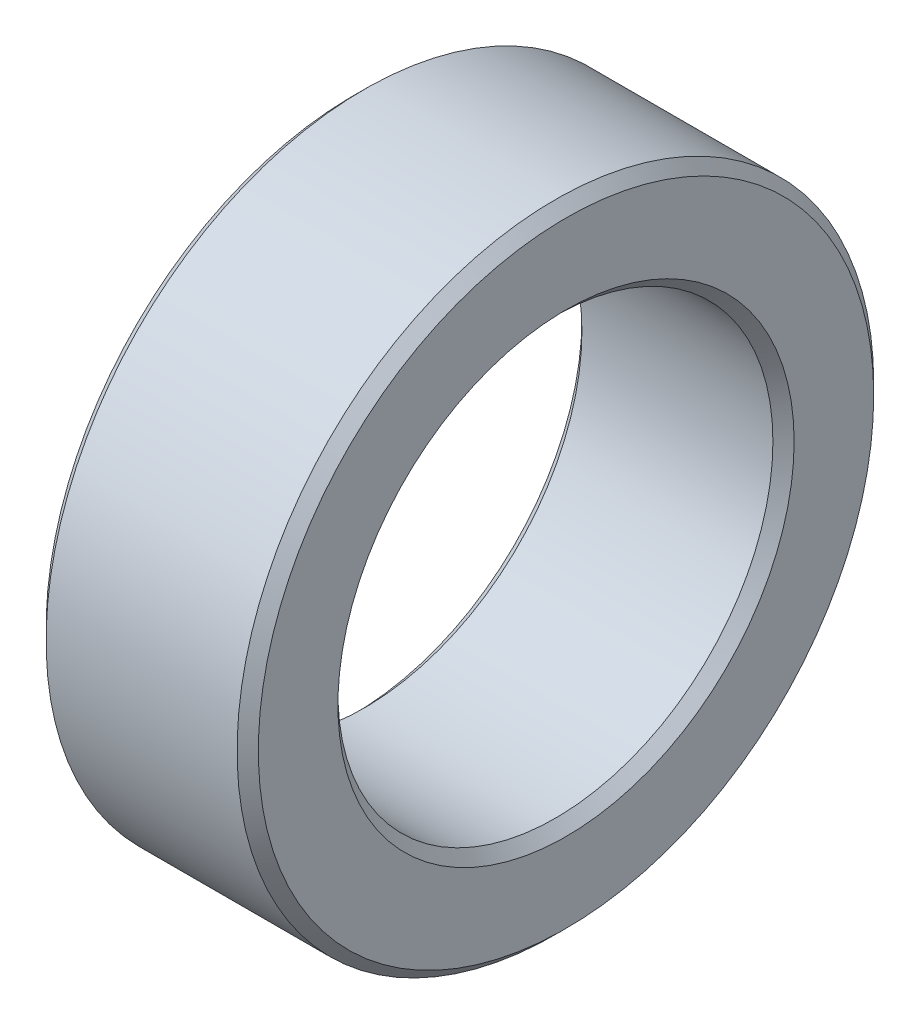
ISO-10303-21;
HEADER;
FILE_DESCRIPTION(('STEP AP214'),'2;1');
FILE_NAME('part.step','',(''),(''),'','','');
FILE_SCHEMA(('AUTOMOTIVE_DESIGN { 1 0 10303 214 1 1 1 1 }'));
ENDSEC;
DATA;
#1=APPLICATION_CONTEXT('core data for automotive mechanical design processes');
#2=APPLICATION_PROTOCOL_DEFINITION('international standard','automotive_design',2000,#1);
#3=PRODUCT_CONTEXT('',#1,'mechanical');
#4=PRODUCT('Part','Part','',(#3));
#5=PRODUCT_RELATED_PRODUCT_CATEGORY('part','',(#4));
#6=PRODUCT_DEFINITION_FORMATION('','',#4);
#7=PRODUCT_DEFINITION_CONTEXT('part definition',#1,'design');
#8=PRODUCT_DEFINITION('design','',#6,#7);
#9=PRODUCT_DEFINITION_SHAPE('','',#8);
#10=(LENGTH_UNIT() NAMED_UNIT(*) SI_UNIT(.MILLI.,.METRE.));
#11=(NAMED_UNIT(*) PLANE_ANGLE_UNIT() SI_UNIT($,.RADIAN.));
#12=(NAMED_UNIT(*) SI_UNIT($,.STERADIAN.) SOLID_ANGLE_UNIT());
#13=UNCERTAINTY_MEASURE_WITH_UNIT(LENGTH_MEASURE(1.E-05),#10,'distance_accuracy_value','');
#14=(GEOMETRIC_REPRESENTATION_CONTEXT(3) GLOBAL_UNCERTAINTY_ASSIGNED_CONTEXT((#13)) GLOBAL_UNIT_ASSIGNED_CONTEXT((#10,
#11,#12)) REPRESENTATION_CONTEXT('',''));
#15=CARTESIAN_POINT('',(0.,0.,0.));
#16=DIRECTION('',(0.,0.,1.));
#17=DIRECTION('',(1.,0.,0.));
#18=AXIS2_PLACEMENT_3D('',#15,#16,#17);
#19=CARTESIAN_POINT('',(2.,0.,0.));
#20=DIRECTION('',(1.,0.,0.));
#21=DIRECTION('',(0.,0.,-1.));
#22=AXIS2_PLACEMENT_3D('',#19,#20,#21);
#23=PLANE('',#22);
#24=CARTESIAN_POINT('',(2.,0.,0.));
#25=DIRECTION('',(1.,0.,0.));
#26=DIRECTION('',(0.,0.,-1.));
#27=AXIS2_PLACEMENT_3D('',#24,#25,#26);
#28=CIRCLE('',#27,2.15);
#29=CARTESIAN_POINT('',(2.,0.,-2.15));
#30=VERTEX_POINT('',#29);
#31=EDGE_CURVE('E60',#30,#30,#28,.F.);
#32=ORIENTED_EDGE('',*,*,#31,.T.);
#33=EDGE_LOOP('',(#32));
#34=FACE_BOUND('',#33,.T.);
#35=CARTESIAN_POINT('',(2.,0.,0.));
#36=DIRECTION('',(1.,0.,0.));
#37=DIRECTION('',(0.,0.,-1.));
#38=AXIS2_PLACEMENT_3D('',#35,#36,#37);
#39=CIRCLE('',#38,2.9);
#40=CARTESIAN_POINT('',(2.,0.,-2.9));
#41=VERTEX_POINT('',#40);
#42=EDGE_CURVE('E63',#41,#41,#39,.T.);
#43=ORIENTED_EDGE('',*,*,#42,.T.);
#44=EDGE_LOOP('',(#43));
#45=FACE_BOUND('',#44,.T.);
#46=ADVANCED_FACE('F39',(#34,#45),#23,.T.);
#47=CARTESIAN_POINT('',(0.,0.,0.));
#48=DIRECTION('',(1.,0.,0.));
#49=DIRECTION('',(0.,0.,-1.));
#50=AXIS2_PLACEMENT_3D('',#47,#48,#49);
#51=PLANE('',#50);
#52=CARTESIAN_POINT('',(0.,0.,0.));
#53=DIRECTION('',(1.,0.,0.));
#54=DIRECTION('',(0.,0.,-1.));
#55=AXIS2_PLACEMENT_3D('',#52,#53,#54);
#56=CIRCLE('',#55,2.15);
#57=CARTESIAN_POINT('',(0.,0.,-2.15));
#58=VERTEX_POINT('',#57);
#59=EDGE_CURVE('E51',#58,#58,#56,.T.);
#60=ORIENTED_EDGE('',*,*,#59,.T.);
#61=EDGE_LOOP('',(#60));
#62=FACE_BOUND('',#61,.T.);
#63=CARTESIAN_POINT('',(0.,0.,0.));
#64=DIRECTION('',(1.,0.,0.));
#65=DIRECTION('',(0.,0.,-1.));
#66=AXIS2_PLACEMENT_3D('',#63,#64,#65);
#67=CIRCLE('',#66,2.9);
#68=CARTESIAN_POINT('',(0.,0.,-2.9));
#69=VERTEX_POINT('',#68);
#70=EDGE_CURVE('E55',#69,#69,#67,.F.);
#71=ORIENTED_EDGE('',*,*,#70,.T.);
#72=EDGE_LOOP('',(#71));
#73=FACE_BOUND('',#72,.T.);
#74=ADVANCED_FACE('F83',(#62,#73),#51,.F.);
#75=CARTESIAN_POINT('',(2.,0.,0.));
#76=DIRECTION('',(-1.,0.,0.));
#77=DIRECTION('',(0.,0.,1.));
#78=AXIS2_PLACEMENT_3D('',#75,#76,#77);
#79=CYLINDRICAL_SURFACE('',#78,3.);
#80=CARTESIAN_POINT('',(0.0999999999999994,0.,0.));
#81=DIRECTION('',(1.,0.,0.));
#82=DIRECTION('',(0.,0.,-1.));
#83=AXIS2_PLACEMENT_3D('',#80,#81,#82);
#84=CIRCLE('',#83,3.);
#85=CARTESIAN_POINT('',(0.0999999999999994,0.,-3.));
#86=VERTEX_POINT('',#85);
#87=EDGE_CURVE('E10',#86,#86,#84,.T.);
#88=ORIENTED_EDGE('',*,*,#87,.T.);
#89=EDGE_LOOP('',(#88));
#90=FACE_BOUND('',#89,.T.);
#91=CARTESIAN_POINT('',(1.9,0.,0.));
#92=DIRECTION('',(1.,0.,0.));
#93=DIRECTION('',(0.,0.,-1.));
#94=AXIS2_PLACEMENT_3D('',#91,#92,#93);
#95=CIRCLE('',#94,3.);
#96=CARTESIAN_POINT('',(1.9,0.,-3.));
#97=VERTEX_POINT('',#96);
#98=EDGE_CURVE('E47',#97,#97,#95,.F.);
#99=ORIENTED_EDGE('',*,*,#98,.T.);
#100=EDGE_LOOP('',(#99));
#101=FACE_BOUND('',#100,.T.);
#102=ADVANCED_FACE('F86',(#90,#101),#79,.T.);
#103=CARTESIAN_POINT('',(2.,0.,0.));
#104=DIRECTION('',(-1.,0.,0.));
#105=DIRECTION('',(0.,0.,1.));
#106=AXIS2_PLACEMENT_3D('',#103,#104,#105);
#107=CYLINDRICAL_SURFACE('',#106,2.05);
#108=CARTESIAN_POINT('',(1.9,0.,0.));
#109=DIRECTION('',(1.,0.,0.));
#110=DIRECTION('',(0.,0.,-1.));
#111=AXIS2_PLACEMENT_3D('',#108,#109,#110);
#112=CIRCLE('',#111,2.05);
#113=CARTESIAN_POINT('',(1.9,0.,-2.05));
#114=VERTEX_POINT('',#113);
#115=EDGE_CURVE('E66',#114,#114,#112,.T.);
#116=ORIENTED_EDGE('',*,*,#115,.T.);
#117=EDGE_LOOP('',(#116));
#118=FACE_BOUND('',#117,.T.);
#119=CARTESIAN_POINT('',(0.100000000000001,0.,0.));
#120=DIRECTION('',(1.,0.,0.));
#121=DIRECTION('',(0.,0.,-1.));
#122=AXIS2_PLACEMENT_3D('',#119,#120,#121);
#123=CIRCLE('',#122,2.05);
#124=CARTESIAN_POINT('',(0.100000000000001,0.,-2.05));
#125=VERTEX_POINT('',#124);
#126=EDGE_CURVE('E69',#125,#125,#123,.F.);
#127=ORIENTED_EDGE('',*,*,#126,.T.);
#128=EDGE_LOOP('',(#127));
#129=FACE_BOUND('',#128,.T.);
#130=ADVANCED_FACE('F73',(#118,#129),#107,.F.);
#131=CARTESIAN_POINT('',(1.9,0.,0.));
#132=DIRECTION('',(1.,0.,0.));
#133=DIRECTION('',(0.,0.,-1.));
#134=AXIS2_PLACEMENT_3D('',#131,#132,#133);
#135=CONICAL_SURFACE('',#134,2.05,0.785398163397446);
#136=CARTESIAN_POINT('',(2.,0.,-2.15));
#137=CARTESIAN_POINT('',(1.99895833333333,0.,-2.14895833333333));
#138=CARTESIAN_POINT('',(1.99791666666667,0.,-2.14791666666667));
#139=CARTESIAN_POINT('',(1.99583333333333,0.,-2.14583333333333));
#140=CARTESIAN_POINT('',(1.99479166666667,0.,-2.14479166666667));
#141=CARTESIAN_POINT('',(1.99270833333333,0.,-2.14270833333333));
#142=CARTESIAN_POINT('',(1.99166666666667,0.,-2.14166666666667));
#143=CARTESIAN_POINT('',(1.98958333333333,0.,-2.13958333333333));
#144=CARTESIAN_POINT('',(1.98854166666667,0.,-2.13854166666667));
#145=CARTESIAN_POINT('',(1.98645833333333,0.,-2.13645833333333));
#146=CARTESIAN_POINT('',(1.98541666666667,0.,-2.13541666666667));
#147=CARTESIAN_POINT('',(1.98333333333333,0.,-2.13333333333333));
#148=CARTESIAN_POINT('',(1.98229166666667,0.,-2.13229166666667));
#149=CARTESIAN_POINT('',(1.98020833333333,0.,-2.13020833333333));
#150=CARTESIAN_POINT('',(1.97916666666667,0.,-2.12916666666667));
#151=CARTESIAN_POINT('',(1.97708333333333,0.,-2.12708333333333));
#152=CARTESIAN_POINT('',(1.97604166666667,0.,-2.12604166666667));
#153=CARTESIAN_POINT('',(1.97395833333333,0.,-2.12395833333333));
#154=CARTESIAN_POINT('',(1.97291666666667,0.,-2.12291666666667));
#155=CARTESIAN_POINT('',(1.97083333333333,0.,-2.12083333333333));
#156=CARTESIAN_POINT('',(1.96979166666667,0.,-2.11979166666667));
#157=CARTESIAN_POINT('',(1.96770833333333,0.,-2.11770833333333));
#158=CARTESIAN_POINT('',(1.96666666666667,0.,-2.11666666666667));
#159=CARTESIAN_POINT('',(1.96458333333333,0.,-2.11458333333333));
#160=CARTESIAN_POINT('',(1.96354166666667,0.,-2.11354166666667));
#161=CARTESIAN_POINT('',(1.96145833333333,0.,-2.11145833333333));
#162=CARTESIAN_POINT('',(1.96041666666667,0.,-2.11041666666667));
#163=CARTESIAN_POINT('',(1.95833333333333,0.,-2.10833333333333));
#164=CARTESIAN_POINT('',(1.95729166666667,0.,-2.10729166666667));
#165=CARTESIAN_POINT('',(1.95520833333333,0.,-2.10520833333333));
#166=CARTESIAN_POINT('',(1.95416666666667,0.,-2.10416666666667));
#167=CARTESIAN_POINT('',(1.95208333333333,0.,-2.10208333333333));
#168=CARTESIAN_POINT('',(1.95104166666667,0.,-2.10104166666667));
#169=CARTESIAN_POINT('',(1.94895833333333,0.,-2.09895833333333));
#170=CARTESIAN_POINT('',(1.94791666666667,0.,-2.09791666666667));
#171=CARTESIAN_POINT('',(1.94583333333333,0.,-2.09583333333333));
#172=CARTESIAN_POINT('',(1.94479166666667,0.,-2.09479166666667));
#173=CARTESIAN_POINT('',(1.94270833333333,0.,-2.09270833333333));
#174=CARTESIAN_POINT('',(1.94166666666667,0.,-2.09166666666667));
#175=CARTESIAN_POINT('',(1.93958333333333,0.,-2.08958333333333));
#176=CARTESIAN_POINT('',(1.93854166666667,0.,-2.08854166666667));
#177=CARTESIAN_POINT('',(1.93645833333333,0.,-2.08645833333333));
#178=CARTESIAN_POINT('',(1.93541666666667,0.,-2.08541666666667));
#179=CARTESIAN_POINT('',(1.93333333333333,0.,-2.08333333333333));
#180=CARTESIAN_POINT('',(1.93229166666667,0.,-2.08229166666667));
#181=CARTESIAN_POINT('',(1.93020833333333,0.,-2.08020833333333));
#182=CARTESIAN_POINT('',(1.92916666666667,0.,-2.07916666666667));
#183=CARTESIAN_POINT('',(1.92708333333333,0.,-2.07708333333333));
#184=CARTESIAN_POINT('',(1.92604166666667,0.,-2.07604166666667));
#185=CARTESIAN_POINT('',(1.92395833333333,0.,-2.07395833333333));
#186=CARTESIAN_POINT('',(1.92291666666667,0.,-2.07291666666667));
#187=CARTESIAN_POINT('',(1.92083333333333,0.,-2.07083333333333));
#188=CARTESIAN_POINT('',(1.91979166666667,0.,-2.06979166666667));
#189=CARTESIAN_POINT('',(1.91770833333333,0.,-2.06770833333333));
#190=CARTESIAN_POINT('',(1.91666666666667,0.,-2.06666666666667));
#191=CARTESIAN_POINT('',(1.91458333333333,0.,-2.06458333333333));
#192=CARTESIAN_POINT('',(1.91354166666667,0.,-2.06354166666667));
#193=CARTESIAN_POINT('',(1.91145833333333,0.,-2.06145833333333));
#194=CARTESIAN_POINT('',(1.91041666666667,0.,-2.06041666666667));
#195=CARTESIAN_POINT('',(1.90833333333333,0.,-2.05833333333333));
#196=CARTESIAN_POINT('',(1.90729166666667,0.,-2.05729166666667));
#197=CARTESIAN_POINT('',(1.90520833333333,0.,-2.05520833333333));
#198=CARTESIAN_POINT('',(1.90416666666667,0.,-2.05416666666667));
#199=CARTESIAN_POINT('',(1.90208333333333,0.,-2.05208333333333));
#200=CARTESIAN_POINT('',(1.90104166666667,0.,-2.05104166666667));
#201=CARTESIAN_POINT('',(1.9,0.,-2.05));
#202=B_SPLINE_CURVE_WITH_KNOTS('',3,(#136,#137,#138,#139,#140,#141,#142,#143,#144,#145,#146,
#147,#148,#149,#150,#151,#152,#153,#154,#155,#156,#157,#158,#159,#160,#161,#162,#163,#164,#165,
#166,#167,#168,#169,#170,#171,#172,#173,#174,#175,#176,#177,#178,#179,#180,#181,#182,#183,#184,
#185,#186,#187,#188,#189,#190,#191,#192,#193,#194,#195,#196,#197,#198,#199,#200,#201),
.UNSPECIFIED.,.F.,.F.,(4,2,2,2,2,2,2,2,2,2,2,2,2,2,2,2,2,2,2,2,2,2,2,2,2,2,2,2,2,2,2,2,4),(0.,
0.00441941738241544,0.00883883476483148,0.0132582521472475,0.0176776695296636,0.022097086912079,
0.0265165042944951,0.0309359216769111,0.0353553390593269,0.0397747564417429,0.0441941738241586,
0.0486135912065747,0.0530330085889904,0.0574524259714065,0.0618718433538222,0.0662912607362383,
0.070710678118654,0.0751300955010699,0.079549512883486,0.0839689302659019,0.0883883476483176,
0.0928077650307337,0.0972271824131496,0.101646599795566,0.106066017177981,0.110485434560397,
0.114904851942813,0.119324269325229,0.123743686707645,0.128163104090061,0.132582521472477,
0.137001938854893,0.141421356237308),.UNSPECIFIED.);
#203=EDGE_CURVE('BSEAM79',#30,#114,#202,.T.);
#204=ORIENTED_EDGE('',*,*,#31,.F.);
#205=ORIENTED_EDGE('',*,*,#115,.F.);
#206=ORIENTED_EDGE('',*,*,#203,.T.);
#207=ORIENTED_EDGE('',*,*,#203,.F.);
#208=EDGE_LOOP('',(#204,#206,#205,#207));
#209=FACE_BOUND('',#208,.T.);
#210=ADVANCED_FACE('F79',(#209),#135,.F.);
#211=CARTESIAN_POINT('',(0.,0.,0.));
#212=DIRECTION('',(-1.,0.,0.));
#213=DIRECTION('',(0.,0.,1.));
#214=AXIS2_PLACEMENT_3D('',#211,#212,#213);
#215=CONICAL_SURFACE('',#214,2.15,0.785398163397442);
#216=ORIENTED_EDGE('',*,*,#126,.F.);
#217=EDGE_LOOP('',(#216));
#218=FACE_BOUND('',#217,.T.);
#219=ORIENTED_EDGE('',*,*,#59,.F.);
#220=EDGE_LOOP('',(#219));
#221=FACE_BOUND('',#220,.T.);
#222=ADVANCED_FACE('F75',(#218,#221),#215,.F.);
#223=CARTESIAN_POINT('',(0.0999999999999994,0.,0.));
#224=DIRECTION('',(1.,0.,0.));
#225=DIRECTION('',(0.,0.,-1.));
#226=AXIS2_PLACEMENT_3D('',#223,#224,#225);
#227=CONICAL_SURFACE('',#226,3.,0.785398163397446);
#228=ORIENTED_EDGE('',*,*,#70,.F.);
#229=EDGE_LOOP('',(#228));
#230=FACE_BOUND('',#229,.T.);
#231=ORIENTED_EDGE('',*,*,#87,.F.);
#232=EDGE_LOOP('',(#231));
#233=FACE_BOUND('',#232,.T.);
#234=ADVANCED_FACE('F78',(#230,#233),#227,.T.);
#235=CARTESIAN_POINT('',(2.,0.,0.));
#236=DIRECTION('',(-1.,0.,0.));
#237=DIRECTION('',(0.,0.,1.));
#238=AXIS2_PLACEMENT_3D('',#235,#236,#237);
#239=CONICAL_SURFACE('',#238,2.9,0.785398163397442);
#240=ORIENTED_EDGE('',*,*,#98,.F.);
#241=EDGE_LOOP('',(#240));
#242=FACE_BOUND('',#241,.T.);
#243=ORIENTED_EDGE('',*,*,#42,.F.);
#244=EDGE_LOOP('',(#243));
#245=FACE_BOUND('',#244,.T.);
#246=ADVANCED_FACE('F42',(#242,#245),#239,.T.);
#247=CLOSED_SHELL('',(#46,#74,#102,#130,#210,#222,#234,#246));
#248=MANIFOLD_SOLID_BREP('B2',#247);
#249=ADVANCED_BREP_SHAPE_REPRESENTATION('',(#18,#248),#14);
#250=SHAPE_DEFINITION_REPRESENTATION(#9,#249);
ENDSEC;
END-ISO-10303-21;
